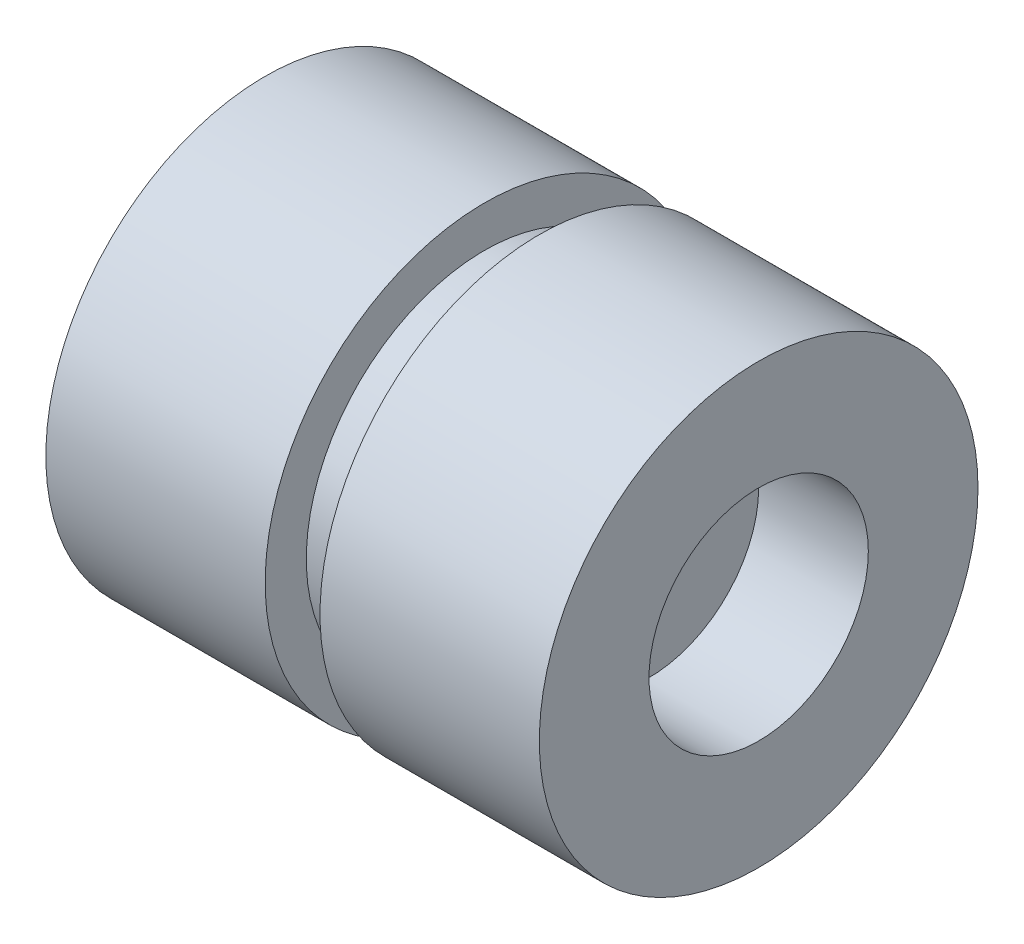
ISO-10303-21;
HEADER;
FILE_DESCRIPTION(('STEP AP214'),'2;1');
FILE_NAME('part.step','',(''),(''),'','','');
FILE_SCHEMA(('AUTOMOTIVE_DESIGN { 1 0 10303 214 1 1 1 1 }'));
ENDSEC;
DATA;
#1=APPLICATION_CONTEXT('core data for automotive mechanical design processes');
#2=APPLICATION_PROTOCOL_DEFINITION('international standard','automotive_design',2000,#1);
#3=PRODUCT_CONTEXT('',#1,'mechanical');
#4=PRODUCT('Part','Part','',(#3));
#5=PRODUCT_RELATED_PRODUCT_CATEGORY('part','',(#4));
#6=PRODUCT_DEFINITION_FORMATION('','',#4);
#7=PRODUCT_DEFINITION_CONTEXT('part definition',#1,'design');
#8=PRODUCT_DEFINITION('design','',#6,#7);
#9=PRODUCT_DEFINITION_SHAPE('','',#8);
#10=(LENGTH_UNIT() NAMED_UNIT(*) SI_UNIT(.MILLI.,.METRE.));
#11=(NAMED_UNIT(*) PLANE_ANGLE_UNIT() SI_UNIT($,.RADIAN.));
#12=(NAMED_UNIT(*) SI_UNIT($,.STERADIAN.) SOLID_ANGLE_UNIT());
#13=UNCERTAINTY_MEASURE_WITH_UNIT(LENGTH_MEASURE(1.E-05),#10,'distance_accuracy_value','');
#14=(GEOMETRIC_REPRESENTATION_CONTEXT(3) GLOBAL_UNCERTAINTY_ASSIGNED_CONTEXT((#13)) GLOBAL_UNIT_ASSIGNED_CONTEXT((#10,
#11,#12)) REPRESENTATION_CONTEXT('',''));
#15=CARTESIAN_POINT('',(0.,0.,0.));
#16=DIRECTION('',(0.,0.,1.));
#17=DIRECTION('',(1.,0.,0.));
#18=AXIS2_PLACEMENT_3D('',#15,#16,#17);
#19=CARTESIAN_POINT('',(101.6,101.6,0.));
#20=DIRECTION('',(1.,0.,0.));
#21=DIRECTION('',(0.,0.,-1.));
#22=AXIS2_PLACEMENT_3D('',#19,#20,#21);
#23=PLANE('',#22);
#24=CARTESIAN_POINT('',(101.6,0.,0.));
#25=DIRECTION('',(1.,0.,0.));
#26=DIRECTION('',(0.,0.,-1.));
#27=AXIS2_PLACEMENT_3D('',#24,#25,#26);
#28=CIRCLE('',#27,50.8);
#29=CARTESIAN_POINT('',(101.6,0.,-50.8));
#30=VERTEX_POINT('',#29);
#31=EDGE_CURVE('E70',#30,#30,#28,.T.);
#32=ORIENTED_EDGE('',*,*,#31,.F.);
#33=EDGE_LOOP('',(#32));
#34=FACE_BOUND('',#33,.T.);
#35=CARTESIAN_POINT('',(101.6,0.,0.));
#36=DIRECTION('',(1.,0.,0.));
#37=DIRECTION('',(0.,0.,-1.));
#38=AXIS2_PLACEMENT_3D('',#35,#36,#37);
#39=CIRCLE('',#38,101.6);
#40=CARTESIAN_POINT('',(101.6,0.,-101.6));
#41=VERTEX_POINT('',#40);
#42=EDGE_CURVE('E139',#41,#41,#39,.T.);
#43=ORIENTED_EDGE('',*,*,#42,.T.);
#44=EDGE_LOOP('',(#43));
#45=FACE_BOUND('',#44,.T.);
#46=ADVANCED_FACE('F39',(#34,#45),#23,.T.);
#47=CARTESIAN_POINT('',(-127.,101.6,0.));
#48=DIRECTION('',(-1.,0.,0.));
#49=DIRECTION('',(0.,0.,1.));
#50=AXIS2_PLACEMENT_3D('',#47,#48,#49);
#51=PLANE('',#50);
#52=CARTESIAN_POINT('',(-127.,0.,0.));
#53=DIRECTION('',(-1.,0.,0.));
#54=DIRECTION('',(0.,0.,1.));
#55=AXIS2_PLACEMENT_3D('',#52,#53,#54);
#56=CIRCLE('',#55,50.8);
#57=CARTESIAN_POINT('',(-127.,1.65947094742302,-50.7728880030933));
#58=VERTEX_POINT('',#57);
#59=EDGE_CURVE('E60',#58,#58,#56,.T.);
#60=ORIENTED_EDGE('',*,*,#59,.F.);
#61=EDGE_LOOP('',(#60));
#62=FACE_BOUND('',#61,.T.);
#63=CARTESIAN_POINT('',(-127.,0.,0.));
#64=DIRECTION('',(1.,0.,0.));
#65=DIRECTION('',(0.,0.,-1.));
#66=AXIS2_PLACEMENT_3D('',#63,#64,#65);
#67=CIRCLE('',#66,101.6);
#68=CARTESIAN_POINT('',(-127.,0.,-101.6));
#69=VERTEX_POINT('',#68);
#70=EDGE_CURVE('E11',#69,#69,#67,.T.);
#71=ORIENTED_EDGE('',*,*,#70,.F.);
#72=EDGE_LOOP('',(#71));
#73=FACE_BOUND('',#72,.T.);
#74=ADVANCED_FACE('F61',(#62,#73),#51,.T.);
#75=CARTESIAN_POINT('',(141.005607476635,0.,0.));
#76=DIRECTION('',(1.,0.,0.));
#77=DIRECTION('',(0.,0.,-1.));
#78=AXIS2_PLACEMENT_3D('',#75,#76,#77);
#79=CYLINDRICAL_SURFACE('',#78,101.6);
#80=ORIENTED_EDGE('',*,*,#70,.T.);
#81=EDGE_LOOP('',(#80));
#82=FACE_BOUND('',#81,.T.);
#83=CARTESIAN_POINT('',(-25.4,0.,0.));
#84=DIRECTION('',(1.,0.,0.));
#85=DIRECTION('',(0.,0.,-1.));
#86=AXIS2_PLACEMENT_3D('',#83,#84,#85);
#87=CIRCLE('',#86,101.6);
#88=CARTESIAN_POINT('',(-25.4,0.,-101.6));
#89=VERTEX_POINT('',#88);
#90=EDGE_CURVE('E48',#89,#89,#87,.T.);
#91=ORIENTED_EDGE('',*,*,#90,.F.);
#92=EDGE_LOOP('',(#91));
#93=FACE_BOUND('',#92,.T.);
#94=ADVANCED_FACE('F123',(#82,#93),#79,.T.);
#95=CARTESIAN_POINT('',(-25.4,82.5499999999999,0.));
#96=DIRECTION('',(1.,0.,0.));
#97=DIRECTION('',(0.,0.,-1.));
#98=AXIS2_PLACEMENT_3D('',#95,#96,#97);
#99=PLANE('',#98);
#100=ORIENTED_EDGE('',*,*,#90,.T.);
#101=EDGE_LOOP('',(#100));
#102=FACE_BOUND('',#101,.T.);
#103=CARTESIAN_POINT('',(-25.4,0.,0.));
#104=DIRECTION('',(1.,0.,0.));
#105=DIRECTION('',(0.,0.,-1.));
#106=AXIS2_PLACEMENT_3D('',#103,#104,#105);
#107=CIRCLE('',#106,82.5499999999999);
#108=CARTESIAN_POINT('',(-25.4,0.,-82.5499999999999));
#109=VERTEX_POINT('',#108);
#110=EDGE_CURVE('E54',#109,#109,#107,.T.);
#111=ORIENTED_EDGE('',*,*,#110,.F.);
#112=EDGE_LOOP('',(#111));
#113=FACE_BOUND('',#112,.T.);
#114=ADVANCED_FACE('F119',(#102,#113),#99,.T.);
#115=CARTESIAN_POINT('',(141.005607476635,0.,0.));
#116=DIRECTION('',(1.,0.,0.));
#117=DIRECTION('',(0.,0.,-1.));
#118=AXIS2_PLACEMENT_3D('',#115,#116,#117);
#119=CYLINDRICAL_SURFACE('',#118,82.5499999999999);
#120=ORIENTED_EDGE('',*,*,#110,.T.);
#121=EDGE_LOOP('',(#120));
#122=FACE_BOUND('',#121,.T.);
#123=CARTESIAN_POINT('',(0.,0.,0.));
#124=DIRECTION('',(1.,0.,0.));
#125=DIRECTION('',(0.,0.,-1.));
#126=AXIS2_PLACEMENT_3D('',#123,#124,#125);
#127=CIRCLE('',#126,82.5499999999999);
#128=CARTESIAN_POINT('',(0.,0.,-82.5499999999999));
#129=VERTEX_POINT('',#128);
#130=EDGE_CURVE('E148',#129,#129,#127,.T.);
#131=ORIENTED_EDGE('',*,*,#130,.F.);
#132=EDGE_LOOP('',(#131));
#133=FACE_BOUND('',#132,.T.);
#134=ADVANCED_FACE('F115',(#122,#133),#119,.T.);
#135=CARTESIAN_POINT('',(0.,82.5499999999999,0.));
#136=DIRECTION('',(-1.,0.,0.));
#137=DIRECTION('',(0.,0.,1.));
#138=AXIS2_PLACEMENT_3D('',#135,#136,#137);
#139=PLANE('',#138);
#140=ORIENTED_EDGE('',*,*,#130,.T.);
#141=EDGE_LOOP('',(#140));
#142=FACE_BOUND('',#141,.T.);
#143=CARTESIAN_POINT('',(0.,0.,0.));
#144=DIRECTION('',(1.,0.,0.));
#145=DIRECTION('',(0.,0.,-1.));
#146=AXIS2_PLACEMENT_3D('',#143,#144,#145);
#147=CIRCLE('',#146,101.6);
#148=CARTESIAN_POINT('',(0.,0.,-101.6));
#149=VERTEX_POINT('',#148);
#150=EDGE_CURVE('E142',#149,#149,#147,.T.);
#151=ORIENTED_EDGE('',*,*,#150,.F.);
#152=EDGE_LOOP('',(#151));
#153=FACE_BOUND('',#152,.T.);
#154=ADVANCED_FACE('F111',(#142,#153),#139,.T.);
#155=CARTESIAN_POINT('',(141.005607476635,0.,0.));
#156=DIRECTION('',(1.,0.,0.));
#157=DIRECTION('',(0.,0.,-1.));
#158=AXIS2_PLACEMENT_3D('',#155,#156,#157);
#159=CYLINDRICAL_SURFACE('',#158,101.6);
#160=ORIENTED_EDGE('',*,*,#150,.T.);
#161=EDGE_LOOP('',(#160));
#162=FACE_BOUND('',#161,.T.);
#163=ORIENTED_EDGE('',*,*,#42,.F.);
#164=EDGE_LOOP('',(#163));
#165=FACE_BOUND('',#164,.T.);
#166=ADVANCED_FACE('F107',(#162,#165),#159,.T.);
#167=CARTESIAN_POINT('',(50.8,0.,0.));
#168=DIRECTION('',(1.,0.,0.));
#169=DIRECTION('',(0.,0.,-1.));
#170=AXIS2_PLACEMENT_3D('',#167,#168,#169);
#171=CYLINDRICAL_SURFACE('',#170,50.8);
#172=CARTESIAN_POINT('',(50.8,0.,0.));
#173=DIRECTION('',(1.,0.,0.));
#174=DIRECTION('',(0.,0.,-1.));
#175=AXIS2_PLACEMENT_3D('',#172,#173,#174);
#176=CIRCLE('',#175,50.8);
#177=CARTESIAN_POINT('',(50.8,0.,-50.8));
#178=VERTEX_POINT('',#177);
#179=EDGE_CURVE('E143',#178,#178,#176,.T.);
#180=ORIENTED_EDGE('',*,*,#179,.F.);
#181=EDGE_LOOP('',(#180));
#182=FACE_BOUND('',#181,.T.);
#183=ORIENTED_EDGE('',*,*,#31,.T.);
#184=EDGE_LOOP('',(#183));
#185=FACE_BOUND('',#184,.T.);
#186=ADVANCED_FACE('F103',(#182,#185),#171,.F.);
#187=CARTESIAN_POINT('',(50.8,0.,0.));
#188=DIRECTION('',(1.,0.,0.));
#189=DIRECTION('',(0.,0.,-1.));
#190=AXIS2_PLACEMENT_3D('',#187,#188,#189);
#191=PLANE('',#190);
#192=ORIENTED_EDGE('',*,*,#179,.T.);
#193=EDGE_LOOP('',(#192));
#194=FACE_BOUND('',#193,.T.);
#195=ADVANCED_FACE('F97',(#194),#191,.T.);
#196=CARTESIAN_POINT('',(-57.15,0.,0.));
#197=DIRECTION('',(1.,0.,0.));
#198=DIRECTION('',(0.,0.,-1.));
#199=AXIS2_PLACEMENT_3D('',#196,#197,#198);
#200=PLANE('',#199);
#201=CARTESIAN_POINT('',(-57.15,0.,0.));
#202=DIRECTION('',(1.,0.,0.));
#203=DIRECTION('',(0.,0.,-1.));
#204=AXIS2_PLACEMENT_3D('',#201,#202,#203);
#205=CIRCLE('',#204,12.7);
#206=CARTESIAN_POINT('',(-57.15,-3.87895348620062,-12.0931269674924));
#207=VERTEX_POINT('',#206);
#208=EDGE_CURVE('E66',#207,#207,#205,.T.);
#209=ORIENTED_EDGE('',*,*,#208,.F.);
#210=EDGE_LOOP('',(#209));
#211=FACE_BOUND('',#210,.T.);
#212=ADVANCED_FACE('F87',(#211),#200,.F.);
#213=CARTESIAN_POINT('',(-127.,1.65947094742302,-50.7728880030933));
#214=CARTESIAN_POINT('',(-57.15,-3.87895348620062,-12.0931269674924));
#215=CARTESIAN_POINT('',(-127.,103.20524695361,-47.4539461082473));
#216=CARTESIAN_POINT('',(-57.15,20.3073004487842,-19.8510339398936));
#217=CARTESIAN_POINT('',(-127.,99.8863050587636,54.0918298979394));
#218=CARTESIAN_POINT('',(-57.15,28.0652074211854,4.3352199950912));
#219=CARTESIAN_POINT('',(-127.,-1.65947094742303,50.7728880030933));
#220=CARTESIAN_POINT('',(-57.15,3.8789534862006,12.0931269674924));
#221=CARTESIAN_POINT('',(-127.,-103.20524695361,47.4539461082473));
#222=CARTESIAN_POINT('',(-57.15,-20.3073004487842,19.8510339398936));
#223=CARTESIAN_POINT('',(-127.,-99.8863050587636,-54.0918298979394));
#224=CARTESIAN_POINT('',(-57.15,-28.0652074211854,-4.3352199950912));
#225=CARTESIAN_POINT('',(-127.,1.65947094742302,-50.7728880030933));
#226=CARTESIAN_POINT('',(-57.15,-3.87895348620062,-12.0931269674924));
#227=(BOUNDED_SURFACE() B_SPLINE_SURFACE(3,1,((#213,#214),(#215,#216),(#217,#218),(#219,#220),
(#221,#222),(#223,#224),(#225,#226)),.UNSPECIFIED.,.T.,.F.,.F.) B_SPLINE_SURFACE_WITH_KNOTS((4,
3,4),(2,2),(0.,0.5,1.),(0.,1.),
.UNSPECIFIED.) GEOMETRIC_REPRESENTATION_ITEM() RATIONAL_B_SPLINE_SURFACE(((1.,1.),
(0.333333333333333,0.333333333333333),(0.333333333333333,0.333333333333333),(1.,1.),
(0.333333333333333,0.333333333333333),(0.333333333333333,0.333333333333333),(1.,1.))) REPRESENTATION_ITEM('') SURFACE());
#228=CARTESIAN_POINT('',(-127.,1.65947094742302,-50.7728880030933));
#229=CARTESIAN_POINT('',(-126.272395833333,1.60177902623944,-50.3699738256391));
#230=CARTESIAN_POINT('',(-125.544791666667,1.54408710505586,-49.967059648185));
#231=CARTESIAN_POINT('',(-124.089583333333,1.4287032626887,-49.1612312932766));
#232=CARTESIAN_POINT('',(-123.361979166667,1.37101134150512,-48.7583171158225));
#233=CARTESIAN_POINT('',(-121.906770833333,1.25562749913796,-47.9524887609141));
#234=CARTESIAN_POINT('',(-121.179166666667,1.19793557795438,-47.5495745834599));
#235=CARTESIAN_POINT('',(-119.723958333333,1.08255173558722,-46.7437462285516));
#236=CARTESIAN_POINT('',(-118.996354166667,1.02485981440365,-46.3408320510974));
#237=CARTESIAN_POINT('',(-117.541145833333,0.909475972036486,-45.5350036961891));
#238=CARTESIAN_POINT('',(-116.813541666667,0.851784050852906,-45.1320895187349));
#239=CARTESIAN_POINT('',(-115.358333333333,0.736400208485747,-44.3262611638265));
#240=CARTESIAN_POINT('',(-114.630729166667,0.678708287302168,-43.9233469863723));
#241=CARTESIAN_POINT('',(-113.175520833333,0.563324444935009,-43.117518631464));
#242=CARTESIAN_POINT('',(-112.447916666667,0.505632523751429,-42.7146044540098));
#243=CARTESIAN_POINT('',(-110.992708333333,0.39024868138427,-41.9087760991015));
#244=CARTESIAN_POINT('',(-110.265104166667,0.332556760200691,-41.5058619216473));
#245=CARTESIAN_POINT('',(-108.809895833333,0.217172917833531,-40.7000335667389));
#246=CARTESIAN_POINT('',(-108.082291666667,0.159480996649952,-40.2971193892847));
#247=CARTESIAN_POINT('',(-106.627083333333,0.044097154282793,-39.4912910343764));
#248=CARTESIAN_POINT('',(-105.899479166667,-0.0135947669007863,-39.0883768569222));
#249=CARTESIAN_POINT('',(-104.444270833333,-0.128978609267945,-38.2825485020139));
#250=CARTESIAN_POINT('',(-103.716666666667,-0.186670530451525,-37.8796343245597));
#251=CARTESIAN_POINT('',(-102.261458333333,-0.302054372818684,-37.0738059696513));
#252=CARTESIAN_POINT('',(-101.533854166667,-0.359746294002264,-36.6708917921972));
#253=CARTESIAN_POINT('',(-100.078645833333,-0.475130136369423,-35.8650634372888));
#254=CARTESIAN_POINT('',(-99.3510416666667,-0.532822057553002,-35.4621492598346));
#255=CARTESIAN_POINT('',(-97.8958333333333,-0.648205899920161,-34.6563209049263));
#256=CARTESIAN_POINT('',(-97.1682291666667,-0.705897821103741,-34.2534067274721));
#257=CARTESIAN_POINT('',(-95.7130208333333,-0.8212816634709,-33.4475783725638));
#258=CARTESIAN_POINT('',(-94.9854166666667,-0.87897358465448,-33.0446641951096));
#259=CARTESIAN_POINT('',(-93.5302083333333,-0.994357427021639,-32.2388358402012));
#260=CARTESIAN_POINT('',(-92.8026041666667,-1.05204934820522,-31.835921662747));
#261=CARTESIAN_POINT('',(-91.3473958333333,-1.16743319057238,-31.0300933078387));
#262=CARTESIAN_POINT('',(-90.6197916666667,-1.22512511175596,-30.6271791303845));
#263=CARTESIAN_POINT('',(-89.1645833333333,-1.34050895412312,-29.8213507754762));
#264=CARTESIAN_POINT('',(-88.4369791666667,-1.3982008753067,-29.418436598022));
#265=CARTESIAN_POINT('',(-86.9817708333333,-1.51358471767385,-28.6126082431136));
#266=CARTESIAN_POINT('',(-86.2541666666667,-1.57127663885743,-28.2096940656595));
#267=CARTESIAN_POINT('',(-84.7989583333333,-1.68666048122459,-27.4038657107511));
#268=CARTESIAN_POINT('',(-84.0713541666667,-1.74435240240817,-27.0009515332969));
#269=CARTESIAN_POINT('',(-82.6161458333333,-1.85973624477533,-26.1951231783886));
#270=CARTESIAN_POINT('',(-81.8885416666667,-1.91742816595891,-25.7922090009344));
#271=CARTESIAN_POINT('',(-80.4333333333333,-2.03281200832607,-24.986380646026));
#272=CARTESIAN_POINT('',(-79.7057291666667,-2.09050392950965,-24.5834664685719));
#273=CARTESIAN_POINT('',(-78.2505208333333,-2.20588777187681,-23.7776381136635));
#274=CARTESIAN_POINT('',(-77.5229166666667,-2.26357969306039,-23.3747239362093));
#275=CARTESIAN_POINT('',(-76.0677083333333,-2.37896353542755,-22.568895581301));
#276=CARTESIAN_POINT('',(-75.3401041666667,-2.43665545661113,-22.1659814038468));
#277=CARTESIAN_POINT('',(-73.8848958333333,-2.55203929897829,-21.3601530489385));
#278=CARTESIAN_POINT('',(-73.1572916666667,-2.60973122016187,-20.9572388714843));
#279=CARTESIAN_POINT('',(-71.7020833333333,-2.72511506252902,-20.1514105165759));
#280=CARTESIAN_POINT('',(-70.9744791666667,-2.7828069837126,-19.7484963391218));
#281=CARTESIAN_POINT('',(-69.5192708333333,-2.89819082607976,-18.9426679842134));
#282=CARTESIAN_POINT('',(-68.7916666666667,-2.95588274726334,-18.5397538067592));
#283=CARTESIAN_POINT('',(-67.3364583333333,-3.0712665896305,-17.7339254518509));
#284=CARTESIAN_POINT('',(-66.6088541666667,-3.12895851081408,-17.3310112743967));
#285=CARTESIAN_POINT('',(-65.1536458333333,-3.24434235318124,-16.5251829194883));
#286=CARTESIAN_POINT('',(-64.4260416666667,-3.30203427436482,-16.1222687420342));
#287=CARTESIAN_POINT('',(-62.9708333333333,-3.41741811673198,-15.3164403871258));
#288=CARTESIAN_POINT('',(-62.2432291666667,-3.47511003791556,-14.9135262096716));
#289=CARTESIAN_POINT('',(-60.7880208333333,-3.59049388028272,-14.1076978547633));
#290=CARTESIAN_POINT('',(-60.0604166666667,-3.6481858014663,-13.7047836773091));
#291=CARTESIAN_POINT('',(-58.6052083333333,-3.76356964383346,-12.8989553224008));
#292=CARTESIAN_POINT('',(-57.8776041666667,-3.82126156501704,-12.4960411449466));
#293=CARTESIAN_POINT('',(-57.15,-3.87895348620062,-12.0931269674924));
#294=B_SPLINE_CURVE_WITH_KNOTS('',3,(#228,#229,#230,#231,#232,#233,#234,#235,#236,#237,#238,
#239,#240,#241,#242,#243,#244,#245,#246,#247,#248,#249,#250,#251,#252,#253,#254,#255,#256,#257,
#258,#259,#260,#261,#262,#263,#264,#265,#266,#267,#268,#269,#270,#271,#272,#273,#274,#275,#276,
#277,#278,#279,#280,#281,#282,#283,#284,#285,#286,#287,#288,#289,#290,#291,#292,#293),
.UNSPECIFIED.,.F.,.F.,(4,2,2,2,2,2,2,2,2,2,2,2,2,2,2,2,2,2,2,2,2,2,2,2,2,2,2,2,2,2,2,2,4),(0.,
2.50113656956734,5.00227313913468,7.50340970870203,10.0045462782694,12.5056828478367,
15.0068194174041,17.5079559869714,20.0090925565387,22.5102291261061,25.0113656956734,
27.5125022652408,30.0136388348081,32.5147754043755,35.0159119739428,37.5170485435101,
40.0181851130775,42.5193216826448,45.0204582522122,47.5215948217795,50.0227313913469,
52.5238679609142,55.0250045304816,57.5261411000489,60.0272776696162,62.5284142391836,
65.0295508087509,67.5306873783183,70.0318239478856,72.532960517453,75.0340970870203,
77.5352336565876,80.036370226155),.UNSPECIFIED.);
#295=EDGE_CURVE('BSEAM96',#58,#207,#294,.T.);
#296=ORIENTED_EDGE('',*,*,#59,.T.);
#297=ORIENTED_EDGE('',*,*,#208,.T.);
#298=ORIENTED_EDGE('',*,*,#295,.T.);
#299=ORIENTED_EDGE('',*,*,#295,.F.);
#300=EDGE_LOOP('',(#296,#298,#297,#299));
#301=FACE_BOUND('',#300,.T.);
#302=ADVANCED_FACE('F96',(#301),#227,.F.);
#303=CLOSED_SHELL('',(#46,#74,#94,#114,#134,#154,#166,#186,#195,#212,#302));
#304=MANIFOLD_SOLID_BREP('B2',#303);
#305=ADVANCED_BREP_SHAPE_REPRESENTATION('',(#18,#304),#14);
#306=SHAPE_DEFINITION_REPRESENTATION(#9,#305);
ENDSEC;
END-ISO-10303-21;
